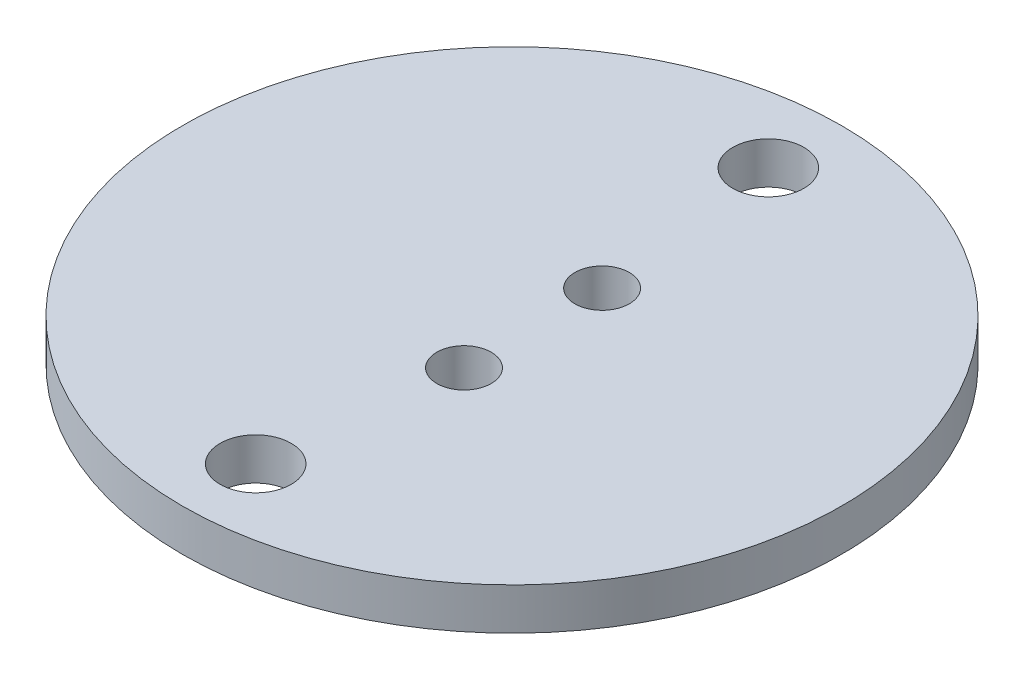
ISO-10303-21;
HEADER;
FILE_DESCRIPTION(('STEP AP214'),'2;1');
FILE_NAME('part.step','',(''),(''),'','','');
FILE_SCHEMA(('AUTOMOTIVE_DESIGN { 1 0 10303 214 1 1 1 1 }'));
ENDSEC;
DATA;
#1=APPLICATION_CONTEXT('core data for automotive mechanical design processes');
#2=APPLICATION_PROTOCOL_DEFINITION('international standard','automotive_design',2000,#1);
#3=PRODUCT_CONTEXT('',#1,'mechanical');
#4=PRODUCT('Part','Part','',(#3));
#5=PRODUCT_RELATED_PRODUCT_CATEGORY('part','',(#4));
#6=PRODUCT_DEFINITION_FORMATION('','',#4);
#7=PRODUCT_DEFINITION_CONTEXT('part definition',#1,'design');
#8=PRODUCT_DEFINITION('design','',#6,#7);
#9=PRODUCT_DEFINITION_SHAPE('','',#8);
#10=(LENGTH_UNIT() NAMED_UNIT(*) SI_UNIT(.MILLI.,.METRE.));
#11=(NAMED_UNIT(*) PLANE_ANGLE_UNIT() SI_UNIT($,.RADIAN.));
#12=(NAMED_UNIT(*) SI_UNIT($,.STERADIAN.) SOLID_ANGLE_UNIT());
#13=UNCERTAINTY_MEASURE_WITH_UNIT(LENGTH_MEASURE(1.E-05),#10,'distance_accuracy_value','');
#14=(GEOMETRIC_REPRESENTATION_CONTEXT(3) GLOBAL_UNCERTAINTY_ASSIGNED_CONTEXT((#13)) GLOBAL_UNIT_ASSIGNED_CONTEXT((#10,
#11,#12)) REPRESENTATION_CONTEXT('',''));
#15=CARTESIAN_POINT('',(0.,0.,0.));
#16=DIRECTION('',(0.,0.,1.));
#17=DIRECTION('',(1.,0.,0.));
#18=AXIS2_PLACEMENT_3D('',#15,#16,#17);
#19=CARTESIAN_POINT('',(0.,1.,0.));
#20=DIRECTION('',(0.,-1.,0.));
#21=DIRECTION('',(0.,0.,-1.));
#22=AXIS2_PLACEMENT_3D('',#19,#20,#21);
#23=CYLINDRICAL_SURFACE('',#22,7.875);
#24=CARTESIAN_POINT('',(0.,1.,0.));
#25=DIRECTION('',(0.,1.,0.));
#26=DIRECTION('',(0.,0.,1.));
#27=AXIS2_PLACEMENT_3D('',#24,#25,#26);
#28=CIRCLE('',#27,7.875);
#29=CARTESIAN_POINT('',(0.,1.,7.875));
#30=VERTEX_POINT('',#29);
#31=EDGE_CURVE('E10',#30,#30,#28,.T.);
#32=ORIENTED_EDGE('',*,*,#31,.F.);
#33=EDGE_LOOP('',(#32));
#34=FACE_BOUND('',#33,.T.);
#35=CARTESIAN_POINT('',(0.,0.,0.));
#36=DIRECTION('',(0.,1.,0.));
#37=DIRECTION('',(0.,0.,1.));
#38=AXIS2_PLACEMENT_3D('',#35,#36,#37);
#39=CIRCLE('',#38,7.875);
#40=CARTESIAN_POINT('',(0.,0.,7.875));
#41=VERTEX_POINT('',#40);
#42=EDGE_CURVE('E38',#41,#41,#39,.T.);
#43=ORIENTED_EDGE('',*,*,#42,.T.);
#44=EDGE_LOOP('',(#43));
#45=FACE_BOUND('',#44,.T.);
#46=ADVANCED_FACE('F31',(#34,#45),#23,.T.);
#47=CARTESIAN_POINT('',(0.,1.,0.));
#48=DIRECTION('',(0.,1.,0.));
#49=DIRECTION('',(0.,0.,1.));
#50=AXIS2_PLACEMENT_3D('',#47,#48,#49);
#51=PLANE('',#50);
#52=CARTESIAN_POINT('',(0.503115294937456,1.,-1.65));
#53=DIRECTION('',(0.,1.,0.));
#54=DIRECTION('',(0.,0.,1.));
#55=AXIS2_PLACEMENT_3D('',#52,#53,#54);
#56=CIRCLE('',#55,0.65);
#57=CARTESIAN_POINT('',(0.503115294937456,1.,-1.));
#58=VERTEX_POINT('',#57);
#59=EDGE_CURVE('E50',#58,#58,#56,.T.);
#60=ORIENTED_EDGE('',*,*,#59,.F.);
#61=EDGE_LOOP('',(#60));
#62=FACE_BOUND('',#61,.T.);
#63=CARTESIAN_POINT('',(0.503115294937456,1.,1.65));
#64=DIRECTION('',(0.,1.,0.));
#65=DIRECTION('',(0.,0.,1.));
#66=AXIS2_PLACEMENT_3D('',#63,#64,#65);
#67=CIRCLE('',#66,0.65);
#68=CARTESIAN_POINT('',(0.503115294937456,1.,2.3));
#69=VERTEX_POINT('',#68);
#70=EDGE_CURVE('E55',#69,#69,#67,.T.);
#71=ORIENTED_EDGE('',*,*,#70,.F.);
#72=EDGE_LOOP('',(#71));
#73=FACE_BOUND('',#72,.T.);
#74=CARTESIAN_POINT('',(0.,1.,-6.125));
#75=DIRECTION('',(0.,1.,0.));
#76=DIRECTION('',(0.,0.,1.));
#77=AXIS2_PLACEMENT_3D('',#74,#75,#76);
#78=CIRCLE('',#77,0.85);
#79=CARTESIAN_POINT('',(0.,1.,-5.275));
#80=VERTEX_POINT('',#79);
#81=EDGE_CURVE('E64',#80,#80,#78,.T.);
#82=ORIENTED_EDGE('',*,*,#81,.F.);
#83=EDGE_LOOP('',(#82));
#84=FACE_BOUND('',#83,.T.);
#85=CARTESIAN_POINT('',(0.,1.,6.125));
#86=DIRECTION('',(0.,1.,0.));
#87=DIRECTION('',(0.,0.,-1.));
#88=AXIS2_PLACEMENT_3D('',#85,#86,#87);
#89=CIRCLE('',#88,0.85);
#90=CARTESIAN_POINT('',(0.,1.,5.275));
#91=VERTEX_POINT('',#90);
#92=EDGE_CURVE('E46',#91,#91,#89,.T.);
#93=ORIENTED_EDGE('',*,*,#92,.F.);
#94=EDGE_LOOP('',(#93));
#95=FACE_BOUND('',#94,.T.);
#96=ORIENTED_EDGE('',*,*,#31,.T.);
#97=EDGE_LOOP('',(#96));
#98=FACE_BOUND('',#97,.T.);
#99=ADVANCED_FACE('F75',(#62,#73,#84,#95,#98),#51,.T.);
#100=CARTESIAN_POINT('',(0.,0.,0.));
#101=DIRECTION('',(0.,1.,0.));
#102=DIRECTION('',(0.,0.,1.));
#103=AXIS2_PLACEMENT_3D('',#100,#101,#102);
#104=PLANE('',#103);
#105=CARTESIAN_POINT('',(0.503115294937456,0.,-1.65));
#106=DIRECTION('',(0.,1.,0.));
#107=DIRECTION('',(0.,0.,1.));
#108=AXIS2_PLACEMENT_3D('',#105,#106,#107);
#109=CIRCLE('',#108,0.65);
#110=CARTESIAN_POINT('',(0.503115294937456,0.,-1.));
#111=VERTEX_POINT('',#110);
#112=EDGE_CURVE('E34',#111,#111,#109,.T.);
#113=ORIENTED_EDGE('',*,*,#112,.T.);
#114=EDGE_LOOP('',(#113));
#115=FACE_BOUND('',#114,.T.);
#116=CARTESIAN_POINT('',(0.503115294937456,0.,1.65));
#117=DIRECTION('',(0.,1.,0.));
#118=DIRECTION('',(0.,0.,1.));
#119=AXIS2_PLACEMENT_3D('',#116,#117,#118);
#120=CIRCLE('',#119,0.65);
#121=CARTESIAN_POINT('',(0.503115294937456,0.,2.3));
#122=VERTEX_POINT('',#121);
#123=EDGE_CURVE('E48',#122,#122,#120,.T.);
#124=ORIENTED_EDGE('',*,*,#123,.T.);
#125=EDGE_LOOP('',(#124));
#126=FACE_BOUND('',#125,.T.);
#127=CARTESIAN_POINT('',(0.,0.,-6.125));
#128=DIRECTION('',(0.,1.,0.));
#129=DIRECTION('',(0.,0.,1.));
#130=AXIS2_PLACEMENT_3D('',#127,#128,#129);
#131=CIRCLE('',#130,0.85);
#132=CARTESIAN_POINT('',(0.,0.,-5.275));
#133=VERTEX_POINT('',#132);
#134=EDGE_CURVE('E43',#133,#133,#131,.T.);
#135=ORIENTED_EDGE('',*,*,#134,.T.);
#136=EDGE_LOOP('',(#135));
#137=FACE_BOUND('',#136,.T.);
#138=CARTESIAN_POINT('',(0.,0.,6.125));
#139=DIRECTION('',(0.,1.,0.));
#140=DIRECTION('',(0.,0.,-1.));
#141=AXIS2_PLACEMENT_3D('',#138,#139,#140);
#142=CIRCLE('',#141,0.85);
#143=CARTESIAN_POINT('',(0.,0.,5.275));
#144=VERTEX_POINT('',#143);
#145=EDGE_CURVE('E66',#144,#144,#142,.T.);
#146=ORIENTED_EDGE('',*,*,#145,.T.);
#147=EDGE_LOOP('',(#146));
#148=FACE_BOUND('',#147,.T.);
#149=ORIENTED_EDGE('',*,*,#42,.F.);
#150=EDGE_LOOP('',(#149));
#151=FACE_BOUND('',#150,.T.);
#152=ADVANCED_FACE('F77',(#115,#126,#137,#148,#151),#104,.F.);
#153=CARTESIAN_POINT('',(0.,0.,6.125));
#154=DIRECTION('',(0.,1.,0.));
#155=DIRECTION('',(0.,0.,1.));
#156=AXIS2_PLACEMENT_3D('',#153,#154,#155);
#157=CYLINDRICAL_SURFACE('',#156,0.85);
#158=ORIENTED_EDGE('',*,*,#145,.F.);
#159=EDGE_LOOP('',(#158));
#160=FACE_BOUND('',#159,.T.);
#161=ORIENTED_EDGE('',*,*,#92,.T.);
#162=EDGE_LOOP('',(#161));
#163=FACE_BOUND('',#162,.T.);
#164=ADVANCED_FACE('F73',(#160,#163),#157,.F.);
#165=CARTESIAN_POINT('',(0.,0.,-6.125));
#166=DIRECTION('',(0.,1.,0.));
#167=DIRECTION('',(0.,0.,1.));
#168=AXIS2_PLACEMENT_3D('',#165,#166,#167);
#169=CYLINDRICAL_SURFACE('',#168,0.85);
#170=ORIENTED_EDGE('',*,*,#134,.F.);
#171=EDGE_LOOP('',(#170));
#172=FACE_BOUND('',#171,.T.);
#173=ORIENTED_EDGE('',*,*,#81,.T.);
#174=EDGE_LOOP('',(#173));
#175=FACE_BOUND('',#174,.T.);
#176=ADVANCED_FACE('F90',(#172,#175),#169,.F.);
#177=CARTESIAN_POINT('',(0.503115294937456,-10.,1.65));
#178=DIRECTION('',(0.,1.,0.));
#179=DIRECTION('',(0.,0.,1.));
#180=AXIS2_PLACEMENT_3D('',#177,#178,#179);
#181=CYLINDRICAL_SURFACE('',#180,0.65);
#182=ORIENTED_EDGE('',*,*,#70,.T.);
#183=EDGE_LOOP('',(#182));
#184=FACE_BOUND('',#183,.T.);
#185=ORIENTED_EDGE('',*,*,#123,.F.);
#186=EDGE_LOOP('',(#185));
#187=FACE_BOUND('',#186,.T.);
#188=ADVANCED_FACE('F94',(#184,#187),#181,.F.);
#189=CARTESIAN_POINT('',(0.503115294937456,-10.,-1.65));
#190=DIRECTION('',(0.,1.,0.));
#191=DIRECTION('',(0.,0.,1.));
#192=AXIS2_PLACEMENT_3D('',#189,#190,#191);
#193=CYLINDRICAL_SURFACE('',#192,0.65);
#194=ORIENTED_EDGE('',*,*,#59,.T.);
#195=EDGE_LOOP('',(#194));
#196=FACE_BOUND('',#195,.T.);
#197=ORIENTED_EDGE('',*,*,#112,.F.);
#198=EDGE_LOOP('',(#197));
#199=FACE_BOUND('',#198,.T.);
#200=ADVANCED_FACE('F98',(#196,#199),#193,.F.);
#201=CLOSED_SHELL('',(#46,#99,#152,#164,#176,#188,#200));
#202=MANIFOLD_SOLID_BREP('B2',#201);
#203=ADVANCED_BREP_SHAPE_REPRESENTATION('',(#18,#202),#14);
#204=SHAPE_DEFINITION_REPRESENTATION(#9,#203);
ENDSEC;
END-ISO-10303-21;
